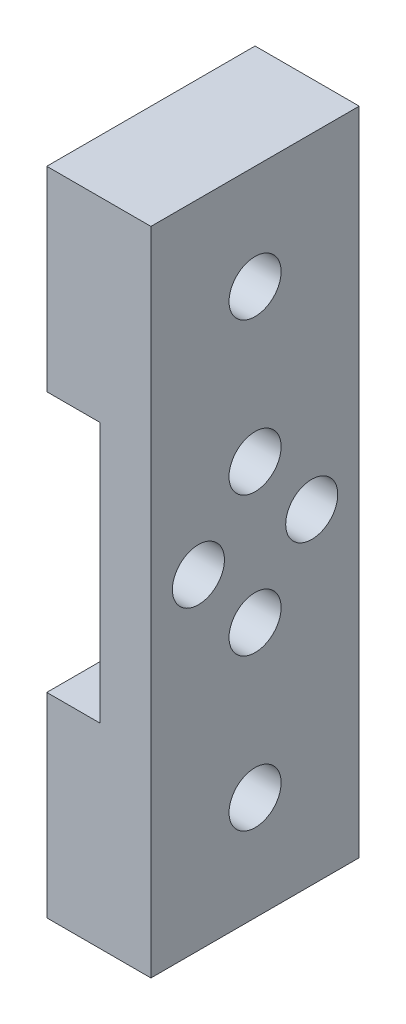
ISO-10303-21;
HEADER;
FILE_DESCRIPTION(('STEP AP214'),'2;1');
FILE_NAME('part.step','',(''),(''),'','','');
FILE_SCHEMA(('AUTOMOTIVE_DESIGN { 1 0 10303 214 1 1 1 1 }'));
ENDSEC;
DATA;
#1=APPLICATION_CONTEXT('core data for automotive mechanical design processes');
#2=APPLICATION_PROTOCOL_DEFINITION('international standard','automotive_design',2000,#1);
#3=PRODUCT_CONTEXT('',#1,'mechanical');
#4=PRODUCT('Part','Part','',(#3));
#5=PRODUCT_RELATED_PRODUCT_CATEGORY('part','',(#4));
#6=PRODUCT_DEFINITION_FORMATION('','',#4);
#7=PRODUCT_DEFINITION_CONTEXT('part definition',#1,'design');
#8=PRODUCT_DEFINITION('design','',#6,#7);
#9=PRODUCT_DEFINITION_SHAPE('','',#8);
#10=(LENGTH_UNIT() NAMED_UNIT(*) SI_UNIT(.MILLI.,.METRE.));
#11=(NAMED_UNIT(*) PLANE_ANGLE_UNIT() SI_UNIT($,.RADIAN.));
#12=(NAMED_UNIT(*) SI_UNIT($,.STERADIAN.) SOLID_ANGLE_UNIT());
#13=UNCERTAINTY_MEASURE_WITH_UNIT(LENGTH_MEASURE(1.E-05),#10,'distance_accuracy_value','');
#14=(GEOMETRIC_REPRESENTATION_CONTEXT(3) GLOBAL_UNCERTAINTY_ASSIGNED_CONTEXT((#13)) GLOBAL_UNIT_ASSIGNED_CONTEXT((#10,
#11,#12)) REPRESENTATION_CONTEXT('',''));
#15=CARTESIAN_POINT('',(0.,0.,0.));
#16=DIRECTION('',(0.,0.,1.));
#17=DIRECTION('',(1.,0.,0.));
#18=AXIS2_PLACEMENT_3D('',#15,#16,#17);
#19=CARTESIAN_POINT('',(12.7,39.6875,12.7));
#20=DIRECTION('',(0.,-1.,0.));
#21=DIRECTION('',(0.,0.,-1.));
#22=AXIS2_PLACEMENT_3D('',#19,#20,#21);
#23=PLANE('',#22);
#24=DIRECTION('',(-1.,0.,0.));
#25=VECTOR('',#24,1.);
#26=CARTESIAN_POINT('',(12.7,39.6875,-12.7));
#27=LINE('',#26,#25);
#28=CARTESIAN_POINT('',(12.7,39.6875,-12.7));
#29=VERTEX_POINT('',#28);
#30=CARTESIAN_POINT('',(0.,39.6875,-12.7));
#31=VERTEX_POINT('',#30);
#32=EDGE_CURVE('E140',#29,#31,#27,.T.);
#33=ORIENTED_EDGE('',*,*,#32,.T.);
#34=DIRECTION('',(0.,0.,-1.));
#35=VECTOR('',#34,1.);
#36=CARTESIAN_POINT('',(0.,39.6875,12.7));
#37=LINE('',#36,#35);
#38=CARTESIAN_POINT('',(0.,39.6875,12.7));
#39=VERTEX_POINT('',#38);
#40=EDGE_CURVE('E11',#39,#31,#37,.T.);
#41=ORIENTED_EDGE('',*,*,#40,.F.);
#42=DIRECTION('',(-1.,0.,0.));
#43=VECTOR('',#42,1.);
#44=CARTESIAN_POINT('',(12.7,39.6875,12.7));
#45=LINE('',#44,#43);
#46=CARTESIAN_POINT('',(12.7,39.6875,12.7));
#47=VERTEX_POINT('',#46);
#48=EDGE_CURVE('E163',#47,#39,#45,.T.);
#49=ORIENTED_EDGE('',*,*,#48,.F.);
#50=DIRECTION('',(0.,0.,-1.));
#51=VECTOR('',#50,1.);
#52=CARTESIAN_POINT('',(12.7,39.6875,12.7));
#53=LINE('',#52,#51);
#54=EDGE_CURVE('E136',#47,#29,#53,.T.);
#55=ORIENTED_EDGE('',*,*,#54,.T.);
#56=EDGE_LOOP('',(#33,#41,#49,#55));
#57=FACE_BOUND('',#56,.T.);
#58=ADVANCED_FACE('F39',(#57),#23,.F.);
#59=CARTESIAN_POINT('',(0.,39.6875,12.7));
#60=DIRECTION('',(1.,0.,0.));
#61=DIRECTION('',(0.,1.,0.));
#62=AXIS2_PLACEMENT_3D('',#59,#60,#61);
#63=PLANE('',#62);
#64=CARTESIAN_POINT('',(0.,26.9875,0.));
#65=DIRECTION('',(-1.,0.,0.));
#66=DIRECTION('',(0.,-1.,0.));
#67=AXIS2_PLACEMENT_3D('',#64,#65,#66);
#68=CIRCLE('',#67,3.175);
#69=CARTESIAN_POINT('',(0.,23.8125,0.));
#70=VERTEX_POINT('',#69);
#71=EDGE_CURVE('E210',#70,#70,#68,.T.);
#72=ORIENTED_EDGE('',*,*,#71,.F.);
#73=EDGE_LOOP('',(#72));
#74=FACE_BOUND('',#73,.T.);
#75=DIRECTION('',(0.,-1.,0.));
#76=VECTOR('',#75,1.);
#77=CARTESIAN_POINT('',(0.,39.6875,-12.7));
#78=LINE('',#77,#76);
#79=CARTESIAN_POINT('',(0.,15.875,-12.7));
#80=VERTEX_POINT('',#79);
#81=EDGE_CURVE('E144',#31,#80,#78,.T.);
#82=ORIENTED_EDGE('',*,*,#81,.T.);
#83=DIRECTION('',(0.,0.,-1.));
#84=VECTOR('',#83,1.);
#85=CARTESIAN_POINT('',(0.,15.875,12.7));
#86=LINE('',#85,#84);
#87=CARTESIAN_POINT('',(0.,15.875,12.7));
#88=VERTEX_POINT('',#87);
#89=EDGE_CURVE('E48',#88,#80,#86,.T.);
#90=ORIENTED_EDGE('',*,*,#89,.F.);
#91=DIRECTION('',(0.,-1.,0.));
#92=VECTOR('',#91,1.);
#93=CARTESIAN_POINT('',(0.,39.6875,12.7));
#94=LINE('',#93,#92);
#95=EDGE_CURVE('E99',#39,#88,#94,.T.);
#96=ORIENTED_EDGE('',*,*,#95,.F.);
#97=ORIENTED_EDGE('',*,*,#40,.T.);
#98=EDGE_LOOP('',(#82,#90,#96,#97));
#99=FACE_BOUND('',#98,.T.);
#100=ADVANCED_FACE('F297',(#74,#99),#63,.F.);
#101=CARTESIAN_POINT('',(0.,15.875,12.7));
#102=DIRECTION('',(0.,1.,0.));
#103=DIRECTION('',(0.,0.,1.));
#104=AXIS2_PLACEMENT_3D('',#101,#102,#103);
#105=PLANE('',#104);
#106=DIRECTION('',(1.,0.,0.));
#107=VECTOR('',#106,1.);
#108=CARTESIAN_POINT('',(0.,15.875,-12.7));
#109=LINE('',#108,#107);
#110=CARTESIAN_POINT('',(6.477,15.875,-12.7));
#111=VERTEX_POINT('',#110);
#112=EDGE_CURVE('E148',#80,#111,#109,.T.);
#113=ORIENTED_EDGE('',*,*,#112,.T.);
#114=DIRECTION('',(0.,0.,-1.));
#115=VECTOR('',#114,1.);
#116=CARTESIAN_POINT('',(6.477,15.875,12.7));
#117=LINE('',#116,#115);
#118=CARTESIAN_POINT('',(6.477,15.875,12.7));
#119=VERTEX_POINT('',#118);
#120=EDGE_CURVE('E174',#119,#111,#117,.T.);
#121=ORIENTED_EDGE('',*,*,#120,.F.);
#122=DIRECTION('',(1.,0.,0.));
#123=VECTOR('',#122,1.);
#124=CARTESIAN_POINT('',(0.,15.875,12.7));
#125=LINE('',#124,#123);
#126=EDGE_CURVE('E184',#88,#119,#125,.T.);
#127=ORIENTED_EDGE('',*,*,#126,.F.);
#128=ORIENTED_EDGE('',*,*,#89,.T.);
#129=EDGE_LOOP('',(#113,#121,#127,#128));
#130=FACE_BOUND('',#129,.T.);
#131=ADVANCED_FACE('F182',(#130),#105,.F.);
#132=CARTESIAN_POINT('',(6.477,15.875,12.7));
#133=DIRECTION('',(1.,0.,0.));
#134=DIRECTION('',(0.,0.,-1.));
#135=AXIS2_PLACEMENT_3D('',#132,#133,#134);
#136=PLANE('',#135);
#137=CARTESIAN_POINT('',(6.477,8.4963,0.));
#138=DIRECTION('',(-1.,0.,0.));
#139=DIRECTION('',(0.,0.,1.));
#140=AXIS2_PLACEMENT_3D('',#137,#138,#139);
#141=CIRCLE('',#140,3.175);
#142=CARTESIAN_POINT('',(6.477,8.4963,3.175));
#143=VERTEX_POINT('',#142);
#144=EDGE_CURVE('E244',#143,#143,#141,.T.);
#145=ORIENTED_EDGE('',*,*,#144,.F.);
#146=EDGE_LOOP('',(#145));
#147=FACE_BOUND('',#146,.T.);
#148=CARTESIAN_POINT('',(6.477,-8.4963,0.));
#149=DIRECTION('',(-1.,0.,0.));
#150=DIRECTION('',(0.,0.,1.));
#151=AXIS2_PLACEMENT_3D('',#148,#149,#150);
#152=CIRCLE('',#151,3.175);
#153=CARTESIAN_POINT('',(6.477,-8.4963,3.175));
#154=VERTEX_POINT('',#153);
#155=EDGE_CURVE('E236',#154,#154,#152,.T.);
#156=ORIENTED_EDGE('',*,*,#155,.F.);
#157=EDGE_LOOP('',(#156));
#158=FACE_BOUND('',#157,.T.);
#159=CARTESIAN_POINT('',(6.477,0.0125000000000056,6.90879434597904));
#160=DIRECTION('',(-1.,0.,0.));
#161=DIRECTION('',(0.,0.,1.));
#162=AXIS2_PLACEMENT_3D('',#159,#160,#161);
#163=CIRCLE('',#162,3.175);
#164=CARTESIAN_POINT('',(6.477,0.0125000000000056,10.083794345979));
#165=VERTEX_POINT('',#164);
#166=EDGE_CURVE('E227',#165,#165,#163,.T.);
#167=ORIENTED_EDGE('',*,*,#166,.F.);
#168=EDGE_LOOP('',(#167));
#169=FACE_BOUND('',#168,.T.);
#170=CARTESIAN_POINT('',(6.477,0.,-6.90880565402096));
#171=DIRECTION('',(-1.,0.,0.));
#172=DIRECTION('',(0.,0.,1.));
#173=AXIS2_PLACEMENT_3D('',#170,#171,#172);
#174=CIRCLE('',#173,3.175);
#175=CARTESIAN_POINT('',(6.477,0.,-3.73380565402096));
#176=VERTEX_POINT('',#175);
#177=EDGE_CURVE('E228',#176,#176,#174,.T.);
#178=ORIENTED_EDGE('',*,*,#177,.F.);
#179=EDGE_LOOP('',(#178));
#180=FACE_BOUND('',#179,.T.);
#181=DIRECTION('',(0.,-1.,0.));
#182=VECTOR('',#181,1.);
#183=CARTESIAN_POINT('',(6.477,15.875,-12.7));
#184=LINE('',#183,#182);
#185=CARTESIAN_POINT('',(6.477,-15.875,-12.7));
#186=VERTEX_POINT('',#185);
#187=EDGE_CURVE('E151',#111,#186,#184,.T.);
#188=ORIENTED_EDGE('',*,*,#187,.T.);
#189=DIRECTION('',(0.,0.,-1.));
#190=VECTOR('',#189,1.);
#191=CARTESIAN_POINT('',(6.477,-15.875,12.7));
#192=LINE('',#191,#190);
#193=CARTESIAN_POINT('',(6.477,-15.875,12.7));
#194=VERTEX_POINT('',#193);
#195=EDGE_CURVE('E170',#194,#186,#192,.T.);
#196=ORIENTED_EDGE('',*,*,#195,.F.);
#197=DIRECTION('',(0.,-1.,0.));
#198=VECTOR('',#197,1.);
#199=CARTESIAN_POINT('',(6.477,15.875,12.7));
#200=LINE('',#199,#198);
#201=EDGE_CURVE('E197',#119,#194,#200,.T.);
#202=ORIENTED_EDGE('',*,*,#201,.F.);
#203=ORIENTED_EDGE('',*,*,#120,.T.);
#204=EDGE_LOOP('',(#188,#196,#202,#203));
#205=FACE_BOUND('',#204,.T.);
#206=ADVANCED_FACE('F192',(#147,#158,#169,#180,#205),#136,.F.);
#207=CARTESIAN_POINT('',(0.,-15.875,12.7));
#208=DIRECTION('',(0.,-1.,0.));
#209=DIRECTION('',(0.,0.,-1.));
#210=AXIS2_PLACEMENT_3D('',#207,#208,#209);
#211=PLANE('',#210);
#212=DIRECTION('',(-1.,0.,0.));
#213=VECTOR('',#212,1.);
#214=CARTESIAN_POINT('',(0.,-15.875,-12.7));
#215=LINE('',#214,#213);
#216=CARTESIAN_POINT('',(0.,-15.875,-12.7));
#217=VERTEX_POINT('',#216);
#218=EDGE_CURVE('E154',#186,#217,#215,.T.);
#219=ORIENTED_EDGE('',*,*,#218,.T.);
#220=DIRECTION('',(0.,0.,-1.));
#221=VECTOR('',#220,1.);
#222=CARTESIAN_POINT('',(0.,-15.875,12.7));
#223=LINE('',#222,#221);
#224=CARTESIAN_POINT('',(0.,-15.875,12.7));
#225=VERTEX_POINT('',#224);
#226=EDGE_CURVE('E129',#225,#217,#223,.T.);
#227=ORIENTED_EDGE('',*,*,#226,.F.);
#228=DIRECTION('',(-1.,0.,0.));
#229=VECTOR('',#228,1.);
#230=CARTESIAN_POINT('',(0.,-15.875,12.7));
#231=LINE('',#230,#229);
#232=EDGE_CURVE('E118',#194,#225,#231,.T.);
#233=ORIENTED_EDGE('',*,*,#232,.F.);
#234=ORIENTED_EDGE('',*,*,#195,.T.);
#235=EDGE_LOOP('',(#219,#227,#233,#234));
#236=FACE_BOUND('',#235,.T.);
#237=ADVANCED_FACE('F195',(#236),#211,.F.);
#238=CARTESIAN_POINT('',(0.,-15.875,12.7));
#239=DIRECTION('',(1.,0.,0.));
#240=DIRECTION('',(0.,1.,0.));
#241=AXIS2_PLACEMENT_3D('',#238,#239,#240);
#242=PLANE('',#241);
#243=CARTESIAN_POINT('',(0.,-26.9875,0.));
#244=DIRECTION('',(1.,0.,0.));
#245=DIRECTION('',(0.,1.,0.));
#246=AXIS2_PLACEMENT_3D('',#243,#244,#245);
#247=CIRCLE('',#246,3.175);
#248=CARTESIAN_POINT('',(0.,-30.1625,0.));
#249=VERTEX_POINT('',#248);
#250=EDGE_CURVE('E214',#249,#249,#247,.T.);
#251=ORIENTED_EDGE('',*,*,#250,.T.);
#252=EDGE_LOOP('',(#251));
#253=FACE_BOUND('',#252,.T.);
#254=DIRECTION('',(0.,-1.,0.));
#255=VECTOR('',#254,1.);
#256=CARTESIAN_POINT('',(0.,-15.875,-12.7));
#257=LINE('',#256,#255);
#258=CARTESIAN_POINT('',(0.,-39.6875,-12.7));
#259=VERTEX_POINT('',#258);
#260=EDGE_CURVE('E127',#217,#259,#257,.T.);
#261=ORIENTED_EDGE('',*,*,#260,.T.);
#262=DIRECTION('',(0.,0.,-1.));
#263=VECTOR('',#262,1.);
#264=CARTESIAN_POINT('',(0.,-39.6875,12.7));
#265=LINE('',#264,#263);
#266=CARTESIAN_POINT('',(0.,-39.6875,12.7));
#267=VERTEX_POINT('',#266);
#268=EDGE_CURVE('E124',#267,#259,#265,.T.);
#269=ORIENTED_EDGE('',*,*,#268,.F.);
#270=DIRECTION('',(0.,-1.,0.));
#271=VECTOR('',#270,1.);
#272=CARTESIAN_POINT('',(0.,-15.875,12.7));
#273=LINE('',#272,#271);
#274=EDGE_CURVE('E112',#225,#267,#273,.T.);
#275=ORIENTED_EDGE('',*,*,#274,.F.);
#276=ORIENTED_EDGE('',*,*,#226,.T.);
#277=EDGE_LOOP('',(#261,#269,#275,#276));
#278=FACE_BOUND('',#277,.T.);
#279=ADVANCED_FACE('F125',(#253,#278),#242,.F.);
#280=CARTESIAN_POINT('',(0.,-39.6875,12.7));
#281=DIRECTION('',(0.,1.,0.));
#282=DIRECTION('',(0.,0.,1.));
#283=AXIS2_PLACEMENT_3D('',#280,#281,#282);
#284=PLANE('',#283);
#285=DIRECTION('',(1.,0.,0.));
#286=VECTOR('',#285,1.);
#287=CARTESIAN_POINT('',(0.,-39.6875,-12.7));
#288=LINE('',#287,#286);
#289=CARTESIAN_POINT('',(12.7,-39.6875,-12.7));
#290=VERTEX_POINT('',#289);
#291=EDGE_CURVE('E85',#259,#290,#288,.T.);
#292=ORIENTED_EDGE('',*,*,#291,.T.);
#293=DIRECTION('',(0.,0.,-1.));
#294=VECTOR('',#293,1.);
#295=CARTESIAN_POINT('',(12.7,-39.6875,12.7));
#296=LINE('',#295,#294);
#297=CARTESIAN_POINT('',(12.7,-39.6875,12.7));
#298=VERTEX_POINT('',#297);
#299=EDGE_CURVE('E130',#298,#290,#296,.T.);
#300=ORIENTED_EDGE('',*,*,#299,.F.);
#301=DIRECTION('',(1.,0.,0.));
#302=VECTOR('',#301,1.);
#303=CARTESIAN_POINT('',(0.,-39.6875,12.7));
#304=LINE('',#303,#302);
#305=EDGE_CURVE('E116',#267,#298,#304,.T.);
#306=ORIENTED_EDGE('',*,*,#305,.F.);
#307=ORIENTED_EDGE('',*,*,#268,.T.);
#308=EDGE_LOOP('',(#292,#300,#306,#307));
#309=FACE_BOUND('',#308,.T.);
#310=ADVANCED_FACE('F132',(#309),#284,.F.);
#311=CARTESIAN_POINT('',(12.7,-39.6875,12.7));
#312=DIRECTION('',(-1.,0.,0.));
#313=DIRECTION('',(0.,0.,1.));
#314=AXIS2_PLACEMENT_3D('',#311,#312,#313);
#315=PLANE('',#314);
#316=CARTESIAN_POINT('',(12.7,8.4963,0.));
#317=DIRECTION('',(-1.,0.,0.));
#318=DIRECTION('',(0.,0.,1.));
#319=AXIS2_PLACEMENT_3D('',#316,#317,#318);
#320=CIRCLE('',#319,3.175);
#321=CARTESIAN_POINT('',(12.7,8.4963,3.175));
#322=VERTEX_POINT('',#321);
#323=EDGE_CURVE('E219',#322,#322,#320,.F.);
#324=ORIENTED_EDGE('',*,*,#323,.F.);
#325=EDGE_LOOP('',(#324));
#326=FACE_BOUND('',#325,.T.);
#327=CARTESIAN_POINT('',(12.7,-8.4963,0.));
#328=DIRECTION('',(-1.,0.,0.));
#329=DIRECTION('',(0.,0.,1.));
#330=AXIS2_PLACEMENT_3D('',#327,#328,#329);
#331=CIRCLE('',#330,3.175);
#332=CARTESIAN_POINT('',(12.7,-8.4963,3.175));
#333=VERTEX_POINT('',#332);
#334=EDGE_CURVE('E240',#333,#333,#331,.F.);
#335=ORIENTED_EDGE('',*,*,#334,.F.);
#336=EDGE_LOOP('',(#335));
#337=FACE_BOUND('',#336,.T.);
#338=CARTESIAN_POINT('',(12.7,0.0125000000000056,6.90879434597904));
#339=DIRECTION('',(-1.,0.,0.));
#340=DIRECTION('',(0.,0.,1.));
#341=AXIS2_PLACEMENT_3D('',#338,#339,#340);
#342=CIRCLE('',#341,3.175);
#343=CARTESIAN_POINT('',(12.7,0.0125000000000056,10.083794345979));
#344=VERTEX_POINT('',#343);
#345=EDGE_CURVE('E232',#344,#344,#342,.F.);
#346=ORIENTED_EDGE('',*,*,#345,.F.);
#347=EDGE_LOOP('',(#346));
#348=FACE_BOUND('',#347,.T.);
#349=CARTESIAN_POINT('',(12.7,0.,-6.90880565402096));
#350=DIRECTION('',(-1.,0.,0.));
#351=DIRECTION('',(0.,0.,1.));
#352=AXIS2_PLACEMENT_3D('',#349,#350,#351);
#353=CIRCLE('',#352,3.175);
#354=CARTESIAN_POINT('',(12.7,0.,-3.73380565402096));
#355=VERTEX_POINT('',#354);
#356=EDGE_CURVE('E223',#355,#355,#353,.F.);
#357=ORIENTED_EDGE('',*,*,#356,.F.);
#358=EDGE_LOOP('',(#357));
#359=FACE_BOUND('',#358,.T.);
#360=CARTESIAN_POINT('',(12.7,-26.9875,0.));
#361=DIRECTION('',(-1.,0.,0.));
#362=DIRECTION('',(0.,0.,1.));
#363=AXIS2_PLACEMENT_3D('',#360,#361,#362);
#364=CIRCLE('',#363,3.175);
#365=CARTESIAN_POINT('',(12.7,-30.1625,0.));
#366=VERTEX_POINT('',#365);
#367=EDGE_CURVE('E215',#366,#366,#364,.T.);
#368=ORIENTED_EDGE('',*,*,#367,.T.);
#369=EDGE_LOOP('',(#368));
#370=FACE_BOUND('',#369,.T.);
#371=CARTESIAN_POINT('',(12.7,26.9875,0.));
#372=DIRECTION('',(-1.,0.,0.));
#373=DIRECTION('',(0.,0.,1.));
#374=AXIS2_PLACEMENT_3D('',#371,#372,#373);
#375=CIRCLE('',#374,3.175);
#376=CARTESIAN_POINT('',(12.7,23.8125,0.));
#377=VERTEX_POINT('',#376);
#378=EDGE_CURVE('E145',#377,#377,#375,.F.);
#379=ORIENTED_EDGE('',*,*,#378,.F.);
#380=EDGE_LOOP('',(#379));
#381=FACE_BOUND('',#380,.T.);
#382=DIRECTION('',(0.,1.,0.));
#383=VECTOR('',#382,1.);
#384=CARTESIAN_POINT('',(12.7,-39.6875,-12.7));
#385=LINE('',#384,#383);
#386=EDGE_CURVE('E91',#290,#29,#385,.T.);
#387=ORIENTED_EDGE('',*,*,#386,.T.);
#388=ORIENTED_EDGE('',*,*,#54,.F.);
#389=DIRECTION('',(0.,1.,0.));
#390=VECTOR('',#389,1.);
#391=CARTESIAN_POINT('',(12.7,-39.6875,12.7));
#392=LINE('',#391,#390);
#393=EDGE_CURVE('E56',#298,#47,#392,.T.);
#394=ORIENTED_EDGE('',*,*,#393,.F.);
#395=ORIENTED_EDGE('',*,*,#299,.T.);
#396=EDGE_LOOP('',(#387,#388,#394,#395));
#397=FACE_BOUND('',#396,.T.);
#398=ADVANCED_FACE('F275',(#326,#337,#348,#359,#370,#381,#397),#315,.F.);
#399=CARTESIAN_POINT('',(0.,0.,12.7));
#400=DIRECTION('',(0.,0.,1.));
#401=DIRECTION('',(1.,0.,0.));
#402=AXIS2_PLACEMENT_3D('',#399,#400,#401);
#403=PLANE('',#402);
#404=ORIENTED_EDGE('',*,*,#48,.T.);
#405=ORIENTED_EDGE('',*,*,#95,.T.);
#406=ORIENTED_EDGE('',*,*,#126,.T.);
#407=ORIENTED_EDGE('',*,*,#201,.T.);
#408=ORIENTED_EDGE('',*,*,#232,.T.);
#409=ORIENTED_EDGE('',*,*,#274,.T.);
#410=ORIENTED_EDGE('',*,*,#305,.T.);
#411=ORIENTED_EDGE('',*,*,#393,.T.);
#412=EDGE_LOOP('',(#404,#405,#406,#407,#408,#409,#410,#411));
#413=FACE_BOUND('',#412,.T.);
#414=ADVANCED_FACE('F114',(#413),#403,.T.);
#415=CARTESIAN_POINT('',(0.,0.,-12.7));
#416=DIRECTION('',(0.,0.,1.));
#417=DIRECTION('',(1.,0.,0.));
#418=AXIS2_PLACEMENT_3D('',#415,#416,#417);
#419=PLANE('',#418);
#420=ORIENTED_EDGE('',*,*,#32,.F.);
#421=ORIENTED_EDGE('',*,*,#386,.F.);
#422=ORIENTED_EDGE('',*,*,#291,.F.);
#423=ORIENTED_EDGE('',*,*,#260,.F.);
#424=ORIENTED_EDGE('',*,*,#218,.F.);
#425=ORIENTED_EDGE('',*,*,#187,.F.);
#426=ORIENTED_EDGE('',*,*,#112,.F.);
#427=ORIENTED_EDGE('',*,*,#81,.F.);
#428=EDGE_LOOP('',(#420,#421,#422,#423,#424,#425,#426,#427));
#429=FACE_BOUND('',#428,.T.);
#430=ADVANCED_FACE('F188',(#429),#419,.F.);
#431=CARTESIAN_POINT('',(12.701,26.9875,0.));
#432=DIRECTION('',(-1.,0.,0.));
#433=DIRECTION('',(0.,-1.,0.));
#434=AXIS2_PLACEMENT_3D('',#431,#432,#433);
#435=CYLINDRICAL_SURFACE('',#434,3.175);
#436=CARTESIAN_POINT('',(0.,23.8125,0.));
#437=CARTESIAN_POINT('',(0.132291666666667,23.8125,0.));
#438=CARTESIAN_POINT('',(0.264583333333333,23.8125,0.));
#439=CARTESIAN_POINT('',(0.529166666666667,23.8125,0.));
#440=CARTESIAN_POINT('',(0.661458333333334,23.8125,0.));
#441=CARTESIAN_POINT('',(0.926041666666668,23.8125,0.));
#442=CARTESIAN_POINT('',(1.05833333333333,23.8125,0.));
#443=CARTESIAN_POINT('',(1.32291666666667,23.8125,0.));
#444=CARTESIAN_POINT('',(1.45520833333333,23.8125,0.));
#445=CARTESIAN_POINT('',(1.71979166666667,23.8125,0.));
#446=CARTESIAN_POINT('',(1.85208333333333,23.8125,0.));
#447=CARTESIAN_POINT('',(2.11666666666667,23.8125,0.));
#448=CARTESIAN_POINT('',(2.24895833333333,23.8125,0.));
#449=CARTESIAN_POINT('',(2.51354166666667,23.8125,0.));
#450=CARTESIAN_POINT('',(2.64583333333333,23.8125,0.));
#451=CARTESIAN_POINT('',(2.91041666666667,23.8125,0.));
#452=CARTESIAN_POINT('',(3.04270833333333,23.8125,0.));
#453=CARTESIAN_POINT('',(3.30729166666667,23.8125,0.));
#454=CARTESIAN_POINT('',(3.43958333333333,23.8125,0.));
#455=CARTESIAN_POINT('',(3.70416666666667,23.8125,0.));
#456=CARTESIAN_POINT('',(3.83645833333334,23.8125,0.));
#457=CARTESIAN_POINT('',(4.10104166666667,23.8125,0.));
#458=CARTESIAN_POINT('',(4.23333333333333,23.8125,0.));
#459=CARTESIAN_POINT('',(4.49791666666667,23.8125,0.));
#460=CARTESIAN_POINT('',(4.63020833333334,23.8125,0.));
#461=CARTESIAN_POINT('',(4.89479166666667,23.8125,0.));
#462=CARTESIAN_POINT('',(5.02708333333334,23.8125,0.));
#463=CARTESIAN_POINT('',(5.29166666666667,23.8125,0.));
#464=CARTESIAN_POINT('',(5.42395833333333,23.8125,0.));
#465=CARTESIAN_POINT('',(5.68854166666667,23.8125,0.));
#466=CARTESIAN_POINT('',(5.82083333333333,23.8125,0.));
#467=CARTESIAN_POINT('',(6.08541666666667,23.8125,0.));
#468=CARTESIAN_POINT('',(6.21770833333334,23.8125,0.));
#469=CARTESIAN_POINT('',(6.48229166666667,23.8125,0.));
#470=CARTESIAN_POINT('',(6.61458333333334,23.8125,0.));
#471=CARTESIAN_POINT('',(6.87916666666667,23.8125,0.));
#472=CARTESIAN_POINT('',(7.01145833333334,23.8125,0.));
#473=CARTESIAN_POINT('',(7.27604166666667,23.8125,0.));
#474=CARTESIAN_POINT('',(7.40833333333334,23.8125,0.));
#475=CARTESIAN_POINT('',(7.67291666666667,23.8125,0.));
#476=CARTESIAN_POINT('',(7.80520833333334,23.8125,0.));
#477=CARTESIAN_POINT('',(8.06979166666667,23.8125,0.));
#478=CARTESIAN_POINT('',(8.20208333333334,23.8125,0.));
#479=CARTESIAN_POINT('',(8.46666666666667,23.8125,0.));
#480=CARTESIAN_POINT('',(8.59895833333334,23.8125,0.));
#481=CARTESIAN_POINT('',(8.86354166666667,23.8125,0.));
#482=CARTESIAN_POINT('',(8.99583333333334,23.8125,0.));
#483=CARTESIAN_POINT('',(9.26041666666667,23.8125,0.));
#484=CARTESIAN_POINT('',(9.39270833333334,23.8125,0.));
#485=CARTESIAN_POINT('',(9.65729166666667,23.8125,0.));
#486=CARTESIAN_POINT('',(9.78958333333334,23.8125,0.));
#487=CARTESIAN_POINT('',(10.0541666666667,23.8125,0.));
#488=CARTESIAN_POINT('',(10.1864583333333,23.8125,0.));
#489=CARTESIAN_POINT('',(10.4510416666667,23.8125,0.));
#490=CARTESIAN_POINT('',(10.5833333333333,23.8125,0.));
#491=CARTESIAN_POINT('',(10.8479166666667,23.8125,0.));
#492=CARTESIAN_POINT('',(10.9802083333333,23.8125,0.));
#493=CARTESIAN_POINT('',(11.2447916666667,23.8125,0.));
#494=CARTESIAN_POINT('',(11.3770833333333,23.8125,0.));
#495=CARTESIAN_POINT('',(11.6416666666667,23.8125,0.));
#496=CARTESIAN_POINT('',(11.7739583333333,23.8125,0.));
#497=CARTESIAN_POINT('',(12.0385416666667,23.8125,0.));
#498=CARTESIAN_POINT('',(12.1708333333333,23.8125,0.));
#499=CARTESIAN_POINT('',(12.4354166666667,23.8125,0.));
#500=CARTESIAN_POINT('',(12.5677083333333,23.8125,0.));
#501=CARTESIAN_POINT('',(12.7,23.8125,0.));
#502=B_SPLINE_CURVE_WITH_KNOTS('',3,(#436,#437,#438,#439,#440,#441,#442,#443,#444,#445,#446,
#447,#448,#449,#450,#451,#452,#453,#454,#455,#456,#457,#458,#459,#460,#461,#462,#463,#464,#465,
#466,#467,#468,#469,#470,#471,#472,#473,#474,#475,#476,#477,#478,#479,#480,#481,#482,#483,#484,
#485,#486,#487,#488,#489,#490,#491,#492,#493,#494,#495,#496,#497,#498,#499,#500,#501),
.UNSPECIFIED.,.F.,.F.,(4,2,2,2,2,2,2,2,2,2,2,2,2,2,2,2,2,2,2,2,2,2,2,2,2,2,2,2,2,2,2,2,4),(0.,
0.396875,0.793750000000001,1.190625,1.5875,1.984375,2.38125,2.778125,3.175,3.571875,3.96875,
4.365625,4.7625,5.159375,5.55625,5.953125,6.35,6.746875,7.14375,7.540625,7.9375,8.334375,
8.73125,9.128125,9.525,9.921875,10.31875,10.715625,11.1125,11.509375,11.90625,12.303125,12.7),.UNSPECIFIED.);
#503=EDGE_CURVE('BSEAM284',#70,#377,#502,.T.);
#504=ORIENTED_EDGE('',*,*,#71,.T.);
#505=ORIENTED_EDGE('',*,*,#378,.T.);
#506=ORIENTED_EDGE('',*,*,#503,.T.);
#507=ORIENTED_EDGE('',*,*,#503,.F.);
#508=EDGE_LOOP('',(#504,#506,#505,#507));
#509=FACE_BOUND('',#508,.T.);
#510=ADVANCED_FACE('F284',(#509),#435,.F.);
#511=CARTESIAN_POINT('',(12.701,-26.9875,0.));
#512=DIRECTION('',(-1.,0.,0.));
#513=DIRECTION('',(0.,-1.,0.));
#514=AXIS2_PLACEMENT_3D('',#511,#512,#513);
#515=CYLINDRICAL_SURFACE('',#514,3.175);
#516=CARTESIAN_POINT('',(0.,-30.1625,0.));
#517=CARTESIAN_POINT('',(0.132291666666667,-30.1625,0.));
#518=CARTESIAN_POINT('',(0.264583333333333,-30.1625,0.));
#519=CARTESIAN_POINT('',(0.529166666666667,-30.1625,0.));
#520=CARTESIAN_POINT('',(0.661458333333334,-30.1625,0.));
#521=CARTESIAN_POINT('',(0.926041666666668,-30.1625,0.));
#522=CARTESIAN_POINT('',(1.05833333333333,-30.1625,0.));
#523=CARTESIAN_POINT('',(1.32291666666667,-30.1625,0.));
#524=CARTESIAN_POINT('',(1.45520833333333,-30.1625,0.));
#525=CARTESIAN_POINT('',(1.71979166666667,-30.1625,0.));
#526=CARTESIAN_POINT('',(1.85208333333333,-30.1625,0.));
#527=CARTESIAN_POINT('',(2.11666666666667,-30.1625,0.));
#528=CARTESIAN_POINT('',(2.24895833333333,-30.1625,0.));
#529=CARTESIAN_POINT('',(2.51354166666667,-30.1625,0.));
#530=CARTESIAN_POINT('',(2.64583333333333,-30.1625,0.));
#531=CARTESIAN_POINT('',(2.91041666666667,-30.1625,0.));
#532=CARTESIAN_POINT('',(3.04270833333333,-30.1625,0.));
#533=CARTESIAN_POINT('',(3.30729166666667,-30.1625,0.));
#534=CARTESIAN_POINT('',(3.43958333333333,-30.1625,0.));
#535=CARTESIAN_POINT('',(3.70416666666667,-30.1625,0.));
#536=CARTESIAN_POINT('',(3.83645833333334,-30.1625,0.));
#537=CARTESIAN_POINT('',(4.10104166666667,-30.1625,0.));
#538=CARTESIAN_POINT('',(4.23333333333333,-30.1625,0.));
#539=CARTESIAN_POINT('',(4.49791666666667,-30.1625,0.));
#540=CARTESIAN_POINT('',(4.63020833333334,-30.1625,0.));
#541=CARTESIAN_POINT('',(4.89479166666667,-30.1625,0.));
#542=CARTESIAN_POINT('',(5.02708333333334,-30.1625,0.));
#543=CARTESIAN_POINT('',(5.29166666666667,-30.1625,0.));
#544=CARTESIAN_POINT('',(5.42395833333333,-30.1625,0.));
#545=CARTESIAN_POINT('',(5.68854166666667,-30.1625,0.));
#546=CARTESIAN_POINT('',(5.82083333333333,-30.1625,0.));
#547=CARTESIAN_POINT('',(6.08541666666667,-30.1625,0.));
#548=CARTESIAN_POINT('',(6.21770833333334,-30.1625,0.));
#549=CARTESIAN_POINT('',(6.48229166666667,-30.1625,0.));
#550=CARTESIAN_POINT('',(6.61458333333334,-30.1625,0.));
#551=CARTESIAN_POINT('',(6.87916666666667,-30.1625,0.));
#552=CARTESIAN_POINT('',(7.01145833333334,-30.1625,0.));
#553=CARTESIAN_POINT('',(7.27604166666667,-30.1625,0.));
#554=CARTESIAN_POINT('',(7.40833333333334,-30.1625,0.));
#555=CARTESIAN_POINT('',(7.67291666666667,-30.1625,0.));
#556=CARTESIAN_POINT('',(7.80520833333334,-30.1625,0.));
#557=CARTESIAN_POINT('',(8.06979166666667,-30.1625,0.));
#558=CARTESIAN_POINT('',(8.20208333333334,-30.1625,0.));
#559=CARTESIAN_POINT('',(8.46666666666667,-30.1625,0.));
#560=CARTESIAN_POINT('',(8.59895833333334,-30.1625,0.));
#561=CARTESIAN_POINT('',(8.86354166666667,-30.1625,0.));
#562=CARTESIAN_POINT('',(8.99583333333334,-30.1625,0.));
#563=CARTESIAN_POINT('',(9.26041666666667,-30.1625,0.));
#564=CARTESIAN_POINT('',(9.39270833333334,-30.1625,0.));
#565=CARTESIAN_POINT('',(9.65729166666667,-30.1625,0.));
#566=CARTESIAN_POINT('',(9.78958333333334,-30.1625,0.));
#567=CARTESIAN_POINT('',(10.0541666666667,-30.1625,0.));
#568=CARTESIAN_POINT('',(10.1864583333333,-30.1625,0.));
#569=CARTESIAN_POINT('',(10.4510416666667,-30.1625,0.));
#570=CARTESIAN_POINT('',(10.5833333333333,-30.1625,0.));
#571=CARTESIAN_POINT('',(10.8479166666667,-30.1625,0.));
#572=CARTESIAN_POINT('',(10.9802083333333,-30.1625,0.));
#573=CARTESIAN_POINT('',(11.2447916666667,-30.1625,0.));
#574=CARTESIAN_POINT('',(11.3770833333333,-30.1625,0.));
#575=CARTESIAN_POINT('',(11.6416666666667,-30.1625,0.));
#576=CARTESIAN_POINT('',(11.7739583333333,-30.1625,0.));
#577=CARTESIAN_POINT('',(12.0385416666667,-30.1625,0.));
#578=CARTESIAN_POINT('',(12.1708333333333,-30.1625,0.));
#579=CARTESIAN_POINT('',(12.4354166666667,-30.1625,0.));
#580=CARTESIAN_POINT('',(12.5677083333333,-30.1625,0.));
#581=CARTESIAN_POINT('',(12.7,-30.1625,0.));
#582=B_SPLINE_CURVE_WITH_KNOTS('',3,(#516,#517,#518,#519,#520,#521,#522,#523,#524,#525,#526,
#527,#528,#529,#530,#531,#532,#533,#534,#535,#536,#537,#538,#539,#540,#541,#542,#543,#544,#545,
#546,#547,#548,#549,#550,#551,#552,#553,#554,#555,#556,#557,#558,#559,#560,#561,#562,#563,#564,
#565,#566,#567,#568,#569,#570,#571,#572,#573,#574,#575,#576,#577,#578,#579,#580,#581),
.UNSPECIFIED.,.F.,.F.,(4,2,2,2,2,2,2,2,2,2,2,2,2,2,2,2,2,2,2,2,2,2,2,2,2,2,2,2,2,2,2,2,4),(0.,
0.396875,0.793750000000001,1.190625,1.5875,1.984375,2.38125,2.778125,3.175,3.571875,3.96875,
4.365625,4.7625,5.159375,5.55625,5.953125,6.35,6.746875,7.14375,7.540625,7.9375,8.334375,
8.73125,9.128125,9.525,9.921875,10.31875,10.715625,11.1125,11.509375,11.90625,12.303125,12.7),.UNSPECIFIED.);
#583=EDGE_CURVE('BSEAM271',#249,#366,#582,.T.);
#584=ORIENTED_EDGE('',*,*,#250,.F.);
#585=ORIENTED_EDGE('',*,*,#367,.F.);
#586=ORIENTED_EDGE('',*,*,#583,.T.);
#587=ORIENTED_EDGE('',*,*,#583,.F.);
#588=EDGE_LOOP('',(#584,#586,#585,#587));
#589=FACE_BOUND('',#588,.T.);
#590=ADVANCED_FACE('F271',(#589),#515,.F.);
#591=CARTESIAN_POINT('',(12.701,0.,-6.90880565402096));
#592=DIRECTION('',(-1.,0.,0.));
#593=DIRECTION('',(0.,0.,1.));
#594=AXIS2_PLACEMENT_3D('',#591,#592,#593);
#595=CYLINDRICAL_SURFACE('',#594,3.175);
#596=ORIENTED_EDGE('',*,*,#177,.T.);
#597=EDGE_LOOP('',(#596));
#598=FACE_BOUND('',#597,.T.);
#599=ORIENTED_EDGE('',*,*,#356,.T.);
#600=EDGE_LOOP('',(#599));
#601=FACE_BOUND('',#600,.T.);
#602=ADVANCED_FACE('F267',(#598,#601),#595,.F.);
#603=CARTESIAN_POINT('',(12.701,0.0125000000000056,6.90879434597904));
#604=DIRECTION('',(-1.,0.,0.));
#605=DIRECTION('',(0.,0.,1.));
#606=AXIS2_PLACEMENT_3D('',#603,#604,#605);
#607=CYLINDRICAL_SURFACE('',#606,3.175);
#608=ORIENTED_EDGE('',*,*,#166,.T.);
#609=EDGE_LOOP('',(#608));
#610=FACE_BOUND('',#609,.T.);
#611=ORIENTED_EDGE('',*,*,#345,.T.);
#612=EDGE_LOOP('',(#611));
#613=FACE_BOUND('',#612,.T.);
#614=ADVANCED_FACE('F270',(#610,#613),#607,.F.);
#615=CARTESIAN_POINT('',(12.701,-8.4963,0.));
#616=DIRECTION('',(-1.,0.,0.));
#617=DIRECTION('',(0.,0.,1.));
#618=AXIS2_PLACEMENT_3D('',#615,#616,#617);
#619=CYLINDRICAL_SURFACE('',#618,3.175);
#620=ORIENTED_EDGE('',*,*,#155,.T.);
#621=EDGE_LOOP('',(#620));
#622=FACE_BOUND('',#621,.T.);
#623=ORIENTED_EDGE('',*,*,#334,.T.);
#624=EDGE_LOOP('',(#623));
#625=FACE_BOUND('',#624,.T.);
#626=ADVANCED_FACE('F376',(#622,#625),#619,.F.);
#627=CARTESIAN_POINT('',(12.701,8.4963,0.));
#628=DIRECTION('',(-1.,0.,0.));
#629=DIRECTION('',(0.,0.,1.));
#630=AXIS2_PLACEMENT_3D('',#627,#628,#629);
#631=CYLINDRICAL_SURFACE('',#630,3.175);
#632=ORIENTED_EDGE('',*,*,#144,.T.);
#633=EDGE_LOOP('',(#632));
#634=FACE_BOUND('',#633,.T.);
#635=ORIENTED_EDGE('',*,*,#323,.T.);
#636=EDGE_LOOP('',(#635));
#637=FACE_BOUND('',#636,.T.);
#638=ADVANCED_FACE('F255',(#634,#637),#631,.F.);
#639=CLOSED_SHELL('',(#58,#100,#131,#206,#237,#279,#310,#398,#414,#430,#510,#590,#602,#614,#626,#638));
#640=MANIFOLD_SOLID_BREP('B2',#639);
#641=ADVANCED_BREP_SHAPE_REPRESENTATION('',(#18,#640),#14);
#642=SHAPE_DEFINITION_REPRESENTATION(#9,#641);
ENDSEC;
END-ISO-10303-21;
